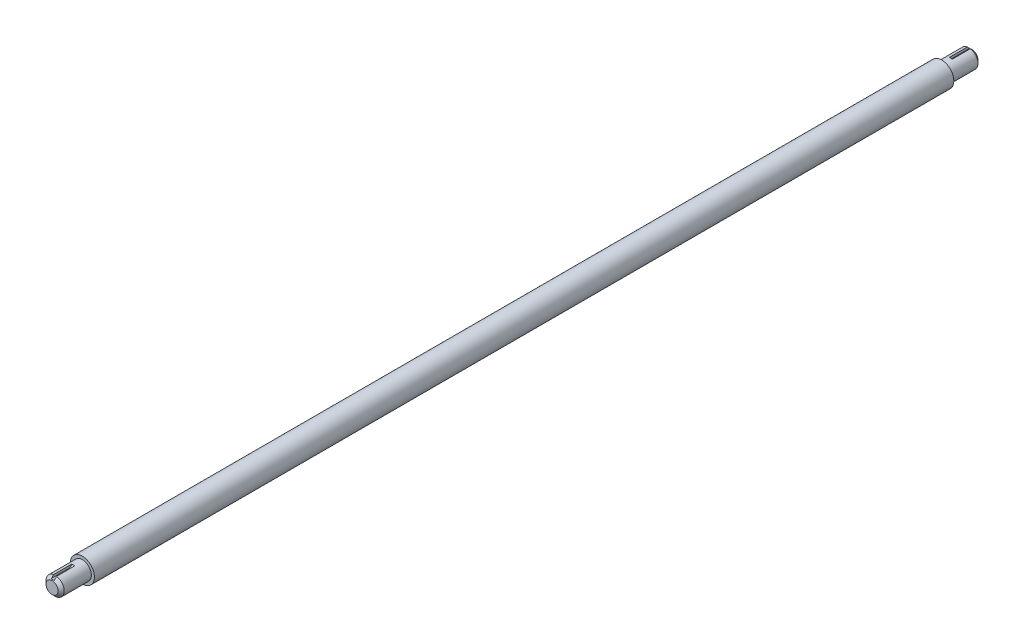
ISO-10303-21;
HEADER;
FILE_DESCRIPTION(('STEP AP214'),'2;1');
FILE_NAME('part.step','',(''),(''),'','','');
FILE_SCHEMA(('AUTOMOTIVE_DESIGN { 1 0 10303 214 1 1 1 1 }'));
ENDSEC;
DATA;
#1=APPLICATION_CONTEXT('core data for automotive mechanical design processes');
#2=APPLICATION_PROTOCOL_DEFINITION('international standard','automotive_design',2000,#1);
#3=PRODUCT_CONTEXT('',#1,'mechanical');
#4=PRODUCT('Part','Part','',(#3));
#5=PRODUCT_RELATED_PRODUCT_CATEGORY('part','',(#4));
#6=PRODUCT_DEFINITION_FORMATION('','',#4);
#7=PRODUCT_DEFINITION_CONTEXT('part definition',#1,'design');
#8=PRODUCT_DEFINITION('design','',#6,#7);
#9=PRODUCT_DEFINITION_SHAPE('','',#8);
#10=(LENGTH_UNIT() NAMED_UNIT(*) SI_UNIT(.MILLI.,.METRE.));
#11=(NAMED_UNIT(*) PLANE_ANGLE_UNIT() SI_UNIT($,.RADIAN.));
#12=(NAMED_UNIT(*) SI_UNIT($,.STERADIAN.) SOLID_ANGLE_UNIT());
#13=UNCERTAINTY_MEASURE_WITH_UNIT(LENGTH_MEASURE(1.E-05),#10,'distance_accuracy_value','');
#14=(GEOMETRIC_REPRESENTATION_CONTEXT(3) GLOBAL_UNCERTAINTY_ASSIGNED_CONTEXT((#13)) GLOBAL_UNIT_ASSIGNED_CONTEXT((#10,
#11,#12)) REPRESENTATION_CONTEXT('',''));
#15=CARTESIAN_POINT('',(0.,0.,0.));
#16=DIRECTION('',(0.,0.,1.));
#17=DIRECTION('',(1.,0.,0.));
#18=AXIS2_PLACEMENT_3D('',#15,#16,#17);
#19=CARTESIAN_POINT('',(-20.24,20.24,-100.));
#20=DIRECTION('',(0.,0.,-1.));
#21=DIRECTION('',(1.,0.,0.));
#22=AXIS2_PLACEMENT_3D('',#19,#20,#21);
#23=PLANE('',#22);
#24=CARTESIAN_POINT('',(0.,0.,-100.));
#25=DIRECTION('',(0.,0.,1.));
#26=DIRECTION('',(1.,0.,0.));
#27=AXIS2_PLACEMENT_3D('',#24,#25,#26);
#28=CIRCLE('',#27,20.);
#29=CARTESIAN_POINT('',(20.,0.,-100.));
#30=VERTEX_POINT('',#29);
#31=EDGE_CURVE('E270',#30,#30,#28,.F.);
#32=ORIENTED_EDGE('',*,*,#31,.T.);
#33=EDGE_LOOP('',(#32));
#34=FACE_BOUND('',#33,.T.);
#35=ADVANCED_FACE('F17',(#34),#23,.T.);
#36=CARTESIAN_POINT('',(-5.,22.,-98.454745261));
#37=DIRECTION('',(0.,1.,0.));
#38=DIRECTION('',(0.,0.,1.));
#39=AXIS2_PLACEMENT_3D('',#36,#37,#38);
#40=PLANE('',#39);
#41=DIRECTION('',(0.,0.,-1.));
#42=VECTOR('',#41,1.);
#43=CARTESIAN_POINT('',(-5.,22.,-63.7194858275));
#44=LINE('',#43,#42);
#45=CARTESIAN_POINT('',(-4.99999982624454,22.0000000000036,-39.7106214535359));
#46=VERTEX_POINT('',#45);
#47=CARTESIAN_POINT('',(-5.00000000144807,22.0000000020197,-97.4389716523527));
#48=VERTEX_POINT('',#47);
#49=EDGE_CURVE('E184',#46,#48,#44,.T.);
#50=ORIENTED_EDGE('',*,*,#49,.F.);
#51=CARTESIAN_POINT('',(5.47389001148944,22.0000000000089,-39.691464493183));
#52=CARTESIAN_POINT('',(4.56164562697729,22.0000000000091,-39.7305832894802));
#53=CARTESIAN_POINT('',(3.64913634182521,22.0000000000092,-39.7565364177244));
#54=CARTESIAN_POINT('',(1.82376031051066,22.0000000000094,-39.790221544182));
#55=CARTESIAN_POINT('',(0.910890728185676,22.0000000000094,-39.7979576280126));
#56=CARTESIAN_POINT('',(-0.915151707805007,22.0000000000094,-39.7979328121126));
#57=CARTESIAN_POINT('',(-1.82770090814348,22.0000000000094,-39.7901709243834));
#58=CARTESIAN_POINT('',(-3.65169196254198,22.0000000000092,-39.756467077981));
#59=CARTESIAN_POINT('',(-4.56313192680437,22.0000000000091,-39.7305184486922));
#60=CARTESIAN_POINT('',(-5.47377689550497,22.0000000000089,-39.691469344167));
#61=(BOUNDED_CURVE() B_SPLINE_CURVE(3,(#51,#52,#53,#54,#55,#56,#57,#58,#59,#60),.UNSPECIFIED.,
.F.,.F.) B_SPLINE_CURVE_WITH_KNOTS((4,2,2,2,4),(0.0164908681633382,0.0192244643562021,
0.0219580605490659,0.0246916567419297,0.0274252529347935),
.UNSPECIFIED.) CURVE() GEOMETRIC_REPRESENTATION_ITEM() RATIONAL_B_SPLINE_CURVE((0.999999540269166,
0.999999530613691,0.999999523105231,0.999999513004027,0.999999510420508,0.999999510428498,
0.999999513020038,0.999999523125189,0.999999530629584,0.999999540267969)) REPRESENTATION_ITEM(''));
#62=CARTESIAN_POINT('',(4.99999985131353,22.0000000000037,-39.7106215036471));
#63=VERTEX_POINT('',#62);
#64=EDGE_CURVE('E87',#46,#63,#61,.F.);
#65=ORIENTED_EDGE('',*,*,#64,.T.);
#66=DIRECTION('',(0.,0.,1.));
#67=VECTOR('',#66,1.);
#68=CARTESIAN_POINT('',(5.,22.,-63.7194858275));
#69=LINE('',#68,#67);
#70=CARTESIAN_POINT('',(5.,22.000000001508,-97.4389716531725));
#71=VERTEX_POINT('',#70);
#72=EDGE_CURVE('E176',#71,#63,#69,.T.);
#73=ORIENTED_EDGE('',*,*,#72,.F.);
#74=CARTESIAN_POINT('',(5.00000000517288,21.9999999993106,-97.4389716531939));
#75=CARTESIAN_POINT('',(4.79368425630204,21.9999999997459,-97.4846970703691));
#76=CARTESIAN_POINT('',(4.58680571553189,21.9999999999304,-97.5278526054406));
#77=CARTESIAN_POINT('',(4.17199827246078,22.0000000000696,-97.6088366908204));
#78=CARTESIAN_POINT('',(3.96406931657152,22.0000000000243,-97.6466649664496));
#79=CARTESIAN_POINT('',(3.33877011606581,21.9999999999514,-97.7518850793836));
#80=CARTESIAN_POINT('',(2.91996834440376,21.9999999999871,-97.8109941600565));
#81=CARTESIAN_POINT('',(2.08492254675457,22.0000000000128,-97.9052739906089));
#82=CARTESIAN_POINT('',(1.66871080220822,22.0000000000034,-97.9407313429312));
#83=CARTESIAN_POINT('',(0.834999231925228,21.9999999999966,-97.9880925447606));
#84=CARTESIAN_POINT('',(0.417499613187339,21.9999999999991,-98.0000000001048));
#85=CARTESIAN_POINT('',(-0.417499623173214,22.0000000000009,-97.9999999998952));
#86=CARTESIAN_POINT('',(-0.834999240795878,22.0000000000002,-97.9880925444045));
#87=CARTESIAN_POINT('',(-1.66871080884589,21.9999999999998,-97.9407313424063));
#88=CARTESIAN_POINT('',(-2.08492255227447,21.9999999999999,-97.9052739900618));
#89=CARTESIAN_POINT('',(-2.91996834767336,22.0000000000001,-97.8109941596103));
#90=CARTESIAN_POINT('',(-3.33877011820313,22.,-97.7518850790634));
#91=CARTESIAN_POINT('',(-3.96406931701422,22.,-97.6466649663554));
#92=CARTESIAN_POINT('',(-4.17199827233912,22.,-97.6088366908077));
#93=CARTESIAN_POINT('',(-4.58680571430622,22.,-97.5278526057163));
#94=CARTESIAN_POINT('',(-4.79368425453672,22.,-97.4846970708515));
#95=CARTESIAN_POINT('',(-5.00000000289306,22.,-97.4389716540019));
#96=B_SPLINE_CURVE_WITH_KNOTS('',3,(#74,#75,#76,#77,#78,#79,#80,#81,#82,#83,#84,#85,#86,#87,#88,
#89,#90,#91,#92,#93,#94,#95),.UNSPECIFIED.,.F.,.F.,(4,2,2,2,2,2,2,2,2,2,4),(0.,
0.633934033856558,1.26790074203564,2.53608223917394,3.78860285014225,5.04093166685659,
6.29326048024456,7.54578108788399,8.81396258160862,9.44792928808013,10.0818633202257),.UNSPECIFIED.);
#97=EDGE_CURVE('E265',#71,#48,#96,.T.);
#98=ORIENTED_EDGE('',*,*,#97,.T.);
#99=EDGE_LOOP('',(#50,#65,#73,#98));
#100=FACE_BOUND('',#99,.T.);
#101=ADVANCED_FACE('F249',(#100),#40,.T.);
#102=CARTESIAN_POINT('',(-5.,22.,-29.59536617));
#103=DIRECTION('',(1.,0.,0.));
#104=DIRECTION('',(0.,0.,-1.));
#105=AXIS2_PLACEMENT_3D('',#102,#103,#104);
#106=PLANE('',#105);
#107=DIRECTION('',(0.,0.,-1.));
#108=VECTOR('',#107,1.);
#109=CARTESIAN_POINT('',(-5.00000000563556,29.5803989145455,-45.));
#110=LINE('',#109,#108);
#111=CARTESIAN_POINT('',(-5.00000000281778,29.5803989118971,-90.0000000030809));
#112=VERTEX_POINT('',#111);
#113=CARTESIAN_POINT('',(-5.00000000281778,29.5803988639591,-29.9999999607556));
#114=VERTEX_POINT('',#113);
#115=EDGE_CURVE('E171',#112,#114,#110,.F.);
#116=ORIENTED_EDGE('',*,*,#115,.T.);
#117=CARTESIAN_POINT('',(-5.,29.5803988133728,-29.9999999515111));
#118=CARTESIAN_POINT('',(-5.,29.3075915698522,-30.0680590807903));
#119=CARTESIAN_POINT('',(-5.,29.0376770340366,-30.1476884773996));
#120=CARTESIAN_POINT('',(-5.,28.5055240211071,-30.3293867897986));
#121=CARTESIAN_POINT('',(-5.,28.2432851550353,-30.4314545663048));
#122=CARTESIAN_POINT('',(-5.,27.7284702758574,-30.6572811804903));
#123=CARTESIAN_POINT('',(-5.,27.4758896614901,-30.7810295285046));
#124=CARTESIAN_POINT('',(-5.,26.9820507614307,-31.049356618786));
#125=CARTESIAN_POINT('',(-5.,26.7407923456044,-31.1939351215594));
#126=CARTESIAN_POINT('',(-5.,26.2712128560046,-31.5029567355292));
#127=CARTESIAN_POINT('',(-5.,26.0428970165574,-31.6674078007018));
#128=CARTESIAN_POINT('',(-5.,25.6009266322717,-32.0149550958334));
#129=CARTESIAN_POINT('',(-5.,25.3872721177616,-32.1980513643598));
#130=CARTESIAN_POINT('',(-5.,24.9762090781648,-32.5815193507735));
#131=CARTESIAN_POINT('',(-5.,24.778795085431,-32.7818852076563));
#132=CARTESIAN_POINT('',(-5.,24.4015315606089,-33.1985183355668));
#133=CARTESIAN_POINT('',(-5.,24.2216818847167,-33.4147854763809));
#134=CARTESIAN_POINT('',(-5.,23.8807119419013,-33.861823675136));
#135=CARTESIAN_POINT('',(-5.,23.7196033204127,-34.0926036153808));
#136=CARTESIAN_POINT('',(-5.,23.4173819051931,-34.5669104903662));
#137=CARTESIAN_POINT('',(-5.,23.2762694551271,-34.810437644089));
#138=CARTESIAN_POINT('',(-5.,23.0150064973749,-35.3085718431165));
#139=CARTESIAN_POINT('',(-5.,22.8948617598486,-35.5631819143496));
#140=CARTESIAN_POINT('',(-5.,22.6764332538102,-36.0816099997116));
#141=CARTESIAN_POINT('',(-5.,22.5781488995276,-36.345427766892));
#142=CARTESIAN_POINT('',(-5.,22.4099516765001,-36.8625092742385));
#143=CARTESIAN_POINT('',(-5.,22.3385819345741,-37.1153004384456));
#144=CARTESIAN_POINT('',(-5.,22.2159193182245,-37.625699441082));
#145=CARTESIAN_POINT('',(-5.,22.1646254711497,-37.8833070455271));
#146=CARTESIAN_POINT('',(-5.,22.0824422477151,-38.4017109884174));
#147=CARTESIAN_POINT('',(-5.,22.0515494529324,-38.6625067851828));
#148=CARTESIAN_POINT('',(-5.,22.0103163081922,-39.1857408831299));
#149=CARTESIAN_POINT('',(-5.,21.9999777814542,-39.4481793279478));
#150=CARTESIAN_POINT('',(-5.,22.000000000009,-39.7106214535359));
#151=B_SPLINE_CURVE_WITH_KNOTS('',3,(#117,#118,#119,#120,#121,#122,#123,#124,#125,#126,#127,
#128,#129,#130,#131,#132,#133,#134,#135,#136,#137,#138,#139,#140,#141,#142,#143,#144,#145,#146,
#147,#148,#149,#150),.UNSPECIFIED.,.F.,.F.,(4,2,2,2,2,2,2,2,2,2,2,2,2,2,2,2,4),(0.,
0.843247838680898,1.68645287228135,2.52925106077263,3.37203956000975,4.21516650891947,
5.05829520186695,5.90113886959256,6.74397563615357,7.58733336349366,8.4307055834799,
9.27430952856135,10.117890865716,10.9051084411617,11.6922878722085,12.4793353691117,
13.2664526761506),.UNSPECIFIED.);
#152=EDGE_CURVE('E183',#114,#46,#151,.T.);
#153=ORIENTED_EDGE('',*,*,#152,.T.);
#154=ORIENTED_EDGE('',*,*,#49,.T.);
#155=CARTESIAN_POINT('',(-4.99999999973077,22.0000000038789,-97.4389716505395));
#156=CARTESIAN_POINT('',(-4.99999999990278,22.6336526474123,-96.821049738444));
#157=CARTESIAN_POINT('',(-4.99999999997383,23.2666765770236,-96.2024839727186));
#158=CARTESIAN_POINT('',(-5.00000000002617,24.5316866836814,-94.9642944420839));
#159=CARTESIAN_POINT('',(-5.00000000000748,25.1636728626604,-94.3446706791492));
#160=CARTESIAN_POINT('',(-4.99999999999252,26.4268290494353,-93.1045930030611));
#161=CARTESIAN_POINT('',(-4.99999999999626,27.0579990578188,-92.4841390905061));
#162=CARTESIAN_POINT('',(-5.00000000000374,28.3196673579101,-91.2425462955128));
#163=CARTESIAN_POINT('',(-5.00000000000748,28.9501656483704,-90.6214074118068));
#164=CARTESIAN_POINT('',(-5.,29.5803989092488,-90.0000000061619));
#165=B_SPLINE_CURVE_WITH_KNOTS('',3,(#155,#156,#157,#158,#159,#160,#161,#162,#163,#164),
.UNSPECIFIED.,.F.,.F.,(4,2,2,2,4),(0.,2.65519894453806,5.31039293864446,7.96558501968443,
10.6207820233168),.UNSPECIFIED.);
#166=EDGE_CURVE('E21',#48,#112,#165,.T.);
#167=ORIENTED_EDGE('',*,*,#166,.T.);
#168=EDGE_LOOP('',(#116,#153,#154,#167));
#169=FACE_BOUND('',#168,.T.);
#170=ADVANCED_FACE('F244',(#169),#106,.T.);
#171=CARTESIAN_POINT('',(5.,22.,-97.843605485));
#172=DIRECTION('',(-1.,0.,0.));
#173=DIRECTION('',(0.,0.,1.));
#174=AXIS2_PLACEMENT_3D('',#171,#172,#173);
#175=PLANE('',#174);
#176=ORIENTED_EDGE('',*,*,#72,.T.);
#177=CARTESIAN_POINT('',(5.,22.0000000000093,-39.7106215036471));
#178=CARTESIAN_POINT('',(5.,21.9999702694099,-39.4290246704989));
#179=CARTESIAN_POINT('',(5.,22.011876875962,-39.1474322448037));
#180=CARTESIAN_POINT('',(5.,22.0593443514043,-38.5862606185158));
#181=CARTESIAN_POINT('',(5.,22.0949041257463,-38.3066813253707));
#182=CARTESIAN_POINT('',(5.,22.1894391403596,-37.7516338502353));
#183=CARTESIAN_POINT('',(5.,22.2484042595103,-37.4761639445856));
#184=CARTESIAN_POINT('',(5.,22.3893218018532,-36.9311718093638));
#185=CARTESIAN_POINT('',(4.99999999999999,22.4712739378507,-36.6616495055289));
#186=CARTESIAN_POINT('',(4.99999999999999,22.6576273044546,-36.1303521225974));
#187=CARTESIAN_POINT('',(5.,22.7620380429585,-35.8685803782796));
#188=CARTESIAN_POINT('',(5.,22.992547225036,-35.3547661373164));
#189=CARTESIAN_POINT('',(5.,23.1186456917132,-35.1027236510357));
#190=CARTESIAN_POINT('',(5.,23.3915885544857,-34.6102487736051));
#191=CARTESIAN_POINT('',(5.,23.5384257076824,-34.3698123682504));
#192=CARTESIAN_POINT('',(5.,23.8518366459279,-33.9021697854187));
#193=CARTESIAN_POINT('',(5.,24.0184102515681,-33.6749634877051));
#194=CARTESIAN_POINT('',(5.,24.3700757212774,-33.2354451206267));
#195=CARTESIAN_POINT('',(5.,24.5551635994552,-33.0231298620796));
#196=CARTESIAN_POINT('',(5.,24.9425781652124,-32.614849704525));
#197=CARTESIAN_POINT('',(5.,25.14490515131,-32.4188850887669));
#198=CARTESIAN_POINT('',(5.,25.5654112075571,-32.0446613698017));
#199=CARTESIAN_POINT('',(5.,25.783594344602,-31.8664068369478));
#200=CARTESIAN_POINT('',(5.,26.2342151484153,-31.5289362003325));
#201=CARTESIAN_POINT('',(5.,26.4666523918164,-31.3697195315334));
#202=CARTESIAN_POINT('',(5.,26.9270674245423,-31.0821157904545));
#203=CARTESIAN_POINT('',(5.,27.1541789379987,-30.9523392426413));
#204=CARTESIAN_POINT('',(5.,27.6178635792027,-30.7109827093422));
#205=CARTESIAN_POINT('',(5.,27.854436202922,-30.5994017561133));
#206=CARTESIAN_POINT('',(5.,28.3355611102571,-30.3951437643027));
#207=CARTESIAN_POINT('',(5.,28.580112141987,-30.3024637763761));
#208=CARTESIAN_POINT('',(5.,29.0757421800611,-30.1365247019609));
#209=CARTESIAN_POINT('',(5.,29.3268218071006,-30.0632674695262));
#210=CARTESIAN_POINT('',(5.,29.5803988041545,-29.9999999546732));
#211=B_SPLINE_CURVE_WITH_KNOTS('',3,(#177,#178,#179,#180,#181,#182,#183,#184,#185,#186,#187,
#188,#189,#190,#191,#192,#193,#194,#195,#196,#197,#198,#199,#200,#201,#202,#203,#204,#205,#206,
#207,#208,#209,#210),.UNSPECIFIED.,.F.,.F.,(4,2,2,2,2,2,2,2,2,2,2,2,2,2,2,2,4),(0.,
0.844532700493406,1.68902632302662,2.53315516022258,3.37727345152956,4.22174980794939,
5.06622706397881,5.91041011586198,6.75458549452655,7.59857952234938,8.44258816802452,
9.28681406013349,10.131014889664,10.9149478569191,11.6988391166545,12.4826079626618,
13.2664515986191),.UNSPECIFIED.);
#212=CARTESIAN_POINT('',(4.99999996501327,29.5803988657401,-29.9999999407779));
#213=VERTEX_POINT('',#212);
#214=EDGE_CURVE('E239',#63,#213,#211,.T.);
#215=ORIENTED_EDGE('',*,*,#214,.T.);
#216=DIRECTION('',(0.,0.,1.));
#217=VECTOR('',#216,1.);
#218=CARTESIAN_POINT('',(5.00000001094782,29.5803989136476,-45.));
#219=LINE('',#218,#217);
#220=CARTESIAN_POINT('',(5.00000000547391,29.580398912719,-90.0000000018279));
#221=VERTEX_POINT('',#220);
#222=EDGE_CURVE('E164',#213,#221,#219,.F.);
#223=ORIENTED_EDGE('',*,*,#222,.T.);
#224=CARTESIAN_POINT('',(5.,29.5803989117905,-90.0000000036558));
#225=CARTESIAN_POINT('',(5.,28.9501656506114,-90.6214074095896));
#226=CARTESIAN_POINT('',(5.,28.319667359857,-91.2425462935913));
#227=CARTESIAN_POINT('',(5.,27.0579990591769,-92.4841390891754));
#228=CARTESIAN_POINT('',(5.,26.4268290504986,-93.1045930020256));
#229=CARTESIAN_POINT('',(5.,25.1636728631203,-94.3446706786895));
#230=CARTESIAN_POINT('',(5.,24.5316866838326,-94.9642944419048));
#231=CARTESIAN_POINT('',(5.,23.26667657661,-96.2024839731547));
#232=CARTESIAN_POINT('',(5.,22.6336526467425,-96.8210497392145));
#233=CARTESIAN_POINT('',(5.,22.0000000030125,-97.4389716517054));
#234=B_SPLINE_CURVE_WITH_KNOTS('',3,(#224,#225,#226,#227,#228,#229,#230,#231,#232,#233),
.UNSPECIFIED.,.F.,.F.,(4,2,2,2,4),(0.,2.6551970048834,5.31038908717456,7.9655830825319,
10.6207820283207),.UNSPECIFIED.);
#235=EDGE_CURVE('E178',#221,#71,#234,.T.);
#236=ORIENTED_EDGE('',*,*,#235,.T.);
#237=EDGE_LOOP('',(#176,#215,#223,#236));
#238=FACE_BOUND('',#237,.T.);
#239=ADVANCED_FACE('F248',(#238),#175,.T.);
#240=CARTESIAN_POINT('',(0.,0.,-100.));
#241=DIRECTION('',(0.,0.,1.));
#242=DIRECTION('',(1.,0.,0.));
#243=AXIS2_PLACEMENT_3D('',#240,#241,#242);
#244=CONICAL_SURFACE('',#243,20.,0.785398163397448);
#245=CARTESIAN_POINT('',(0.,0.,-90.));
#246=DIRECTION('',(0.,0.,1.));
#247=DIRECTION('',(0.,-1.,0.));
#248=AXIS2_PLACEMENT_3D('',#245,#246,#247);
#249=CIRCLE('',#248,30.);
#250=EDGE_CURVE('E81',#221,#112,#249,.F.);
#251=ORIENTED_EDGE('',*,*,#250,.T.);
#252=ORIENTED_EDGE('',*,*,#166,.F.);
#253=ORIENTED_EDGE('',*,*,#97,.F.);
#254=ORIENTED_EDGE('',*,*,#235,.F.);
#255=EDGE_LOOP('',(#251,#252,#253,#254));
#256=FACE_BOUND('',#255,.T.);
#257=ORIENTED_EDGE('',*,*,#31,.F.);
#258=EDGE_LOOP('',(#257));
#259=FACE_BOUND('',#258,.T.);
#260=ADVANCED_FACE('F208',(#256,#259),#244,.T.);
#261=CARTESIAN_POINT('',(5.058300033,29.570485298,-30.));
#262=CARTESIAN_POINT('',(5.139532758,22.,-31.894328819));
#263=CARTESIAN_POINT('',(5.473890584,22.,-39.691477844));
#264=CARTESIAN_POINT('',(4.239311205,29.710580775,-30.));
#265=CARTESIAN_POINT('',(4.293809195,22.,-31.813638981));
#266=CARTESIAN_POINT('',(4.561646083,22.,-39.730596769));
#267=CARTESIAN_POINT('',(3.402436291,29.81853391,-30.));
#268=CARTESIAN_POINT('',(3.443736571,22.,-31.747444553));
#269=CARTESIAN_POINT('',(3.64913669,22.,-39.756549994));
#270=CARTESIAN_POINT('',(1.709747052,29.963282568,-30.));
#271=CARTESIAN_POINT('',(1.726140912,22.,-31.656830968));
#272=CARTESIAN_POINT('',(1.823760475,22.,-39.790235249));
#273=CARTESIAN_POINT('',(0.853960126,30.000056921,-30.));
#274=CARTESIAN_POINT('',(0.863450629,22.,-31.632956497));
#275=CARTESIAN_POINT('',(0.910890808,22.,-39.797971365));
#276=CARTESIAN_POINT('',(-0.857954795,29.999942946,-30.));
#277=CARTESIAN_POINT('',(-0.867485573,22.,-31.633029912));
#278=CARTESIAN_POINT('',(-0.915151788,22.,-39.797946549));
#279=CARTESIAN_POINT('',(-1.713423042,29.963053906,-30.));
#280=CARTESIAN_POINT('',(-1.72986453,22.,-31.656977107));
#281=CARTESIAN_POINT('',(-1.827701073,22.,-39.790184629));
#282=CARTESIAN_POINT('',(-3.404784229,29.818247136,-30.));
#283=CARTESIAN_POINT('',(-3.446127523,22.,-31.747620873));
#284=CARTESIAN_POINT('',(-3.651692311,22.,-39.756480654));
#285=CARTESIAN_POINT('',(-4.240646003,29.710349555,-30.));
#286=CARTESIAN_POINT('',(-4.295196438,22.,-31.813772538));
#287=CARTESIAN_POINT('',(-4.563132383,22.,-39.730531928));
#288=CARTESIAN_POINT('',(-5.058198476,29.57050267,-30.));
#289=CARTESIAN_POINT('',(-5.139428475,22.,-31.894318869));
#290=CARTESIAN_POINT('',(-5.473777468,22.,-39.691482695));
#291=(BOUNDED_SURFACE() B_SPLINE_SURFACE(3,2,((#261,#262,#263),(#264,#265,#266),(#267,#268,
#269),(#270,#271,#272),(#273,#274,#275),(#276,#277,#278),(#279,#280,#281),(#282,#283,#284),
(#285,#286,#287),(#288,#289,#290)),.UNSPECIFIED.,.F.,.F.,.F.) B_SPLINE_SURFACE_WITH_KNOTS((4,2,
2,2,4),(3,3),(0.0164908681633382,0.0192244643562021,0.0219580605490659,0.0246916567419297,
0.0274252529347935),(0.,1.),
.UNSPECIFIED.) GEOMETRIC_REPRESENTATION_ITEM() RATIONAL_B_SPLINE_SURFACE(((1.,0.788337323158158,
1.),(1.,0.78389188793214,1.),(1.,0.780434950289406,1.),(1.,0.775784299093997,1.),(1.,
0.774594832114863,1.),(1.,0.774598510659955,1.),(1.,0.775791670523801,1.),(1.,0.780444139292732,
1.),(1.,0.7838992049373,1.),(1.,0.788336772252647,1.))) REPRESENTATION_ITEM('') SURFACE());
#292=CARTESIAN_POINT('',(-4.99999986287883,29.5803989386758,-29.9999999260212));
#293=CARTESIAN_POINT('',(-4.58576232278662,29.6504184744744,-29.9999916481539));
#294=CARTESIAN_POINT('',(-4.17009865387382,29.7117268597878,-29.9999906136708));
#295=CARTESIAN_POINT('',(-3.33656573732168,29.816837625825,-29.9999937199489));
#296=CARTESIAN_POINT('',(-2.91869649990553,29.8606400876198,-29.9999978606861));
#297=CARTESIAN_POINT('',(-1.66875109952642,29.9651616224614,-30.0000040488849));
#298=CARTESIAN_POINT('',(-0.834375494869063,30.0000000030486,-30.0000000103293));
#299=CARTESIAN_POINT('',(0.834375689148535,29.9999999969514,-29.9999999895193));
#300=CARTESIAN_POINT('',(1.66875126850878,29.9651616123556,-30.0000040072646));
#301=CARTESIAN_POINT('',(2.91869663080722,29.8606400746458,-29.9999978918557));
#302=CARTESIAN_POINT('',(3.3365658554143,29.8168376124312,-29.9999937930545));
#303=CARTESIAN_POINT('',(4.1700987464247,29.711726846619,-29.9999907150406));
#304=CARTESIAN_POINT('',(4.58576240260481,29.6504184619503,-29.9999917358518));
#305=CARTESIAN_POINT('',(4.99999993002654,29.5803989273258,-29.9999999268826));
#306=B_SPLINE_CURVE_WITH_KNOTS('',3,(#292,#293,#294,#295,#296,#297,#298,#299,#300,#301,#302,
#303,#304,#305),.UNSPECIFIED.,.F.,.F.,(4,2,2,2,2,2,4),(0.,1.26015705099986,2.52030826607842,
5.02253114327451,7.52475394546816,8.78490512248638,10.045062135441),.UNSPECIFIED.);
#307=EDGE_CURVE('E173',#114,#213,#306,.T.);
#308=ORIENTED_EDGE('',*,*,#152,.F.);
#309=ORIENTED_EDGE('',*,*,#307,.T.);
#310=ORIENTED_EDGE('',*,*,#214,.F.);
#311=ORIENTED_EDGE('',*,*,#64,.F.);
#312=EDGE_LOOP('',(#308,#309,#310,#311));
#313=FACE_BOUND('',#312,.T.);
#314=ADVANCED_FACE('F197',(#313),#291,.F.);
#315=CARTESIAN_POINT('',(0.,0.,-90.));
#316=DIRECTION('',(0.,0.,1.));
#317=DIRECTION('',(1.,0.,0.));
#318=AXIS2_PLACEMENT_3D('',#315,#316,#317);
#319=CYLINDRICAL_SURFACE('',#318,30.);
#320=CARTESIAN_POINT('',(0.,0.,0.));
#321=DIRECTION('',(0.,0.,1.));
#322=DIRECTION('',(1.,0.,0.));
#323=AXIS2_PLACEMENT_3D('',#320,#321,#322);
#324=CIRCLE('',#323,30.);
#325=CARTESIAN_POINT('',(30.,0.,0.));
#326=VERTEX_POINT('',#325);
#327=EDGE_CURVE('E236',#326,#326,#324,.F.);
#328=ORIENTED_EDGE('',*,*,#327,.T.);
#329=EDGE_LOOP('',(#328));
#330=FACE_BOUND('',#329,.T.);
#331=ORIENTED_EDGE('',*,*,#307,.F.);
#332=ORIENTED_EDGE('',*,*,#115,.F.);
#333=ORIENTED_EDGE('',*,*,#250,.F.);
#334=ORIENTED_EDGE('',*,*,#222,.F.);
#335=EDGE_LOOP('',(#331,#332,#333,#334));
#336=FACE_BOUND('',#335,.T.);
#337=ADVANCED_FACE('F207',(#330,#336),#319,.T.);
#338=CARTESIAN_POINT('',(-40.48,-40.48,0.));
#339=DIRECTION('',(0.,0.,1.));
#340=DIRECTION('',(1.,0.,0.));
#341=AXIS2_PLACEMENT_3D('',#338,#339,#340);
#342=PLANE('',#341);
#343=ORIENTED_EDGE('',*,*,#327,.F.);
#344=EDGE_LOOP('',(#343));
#345=FACE_BOUND('',#344,.T.);
#346=CARTESIAN_POINT('',(0.,0.,0.));
#347=DIRECTION('',(0.,0.,-1.));
#348=DIRECTION('',(-1.,0.,0.));
#349=AXIS2_PLACEMENT_3D('',#346,#347,#348);
#350=CIRCLE('',#349,40.);
#351=CARTESIAN_POINT('',(-40.,0.,0.));
#352=VERTEX_POINT('',#351);
#353=EDGE_CURVE('E331',#352,#352,#350,.T.);
#354=ORIENTED_EDGE('',*,*,#353,.T.);
#355=EDGE_LOOP('',(#354));
#356=FACE_BOUND('',#355,.T.);
#357=ADVANCED_FACE('F257',(#345,#356),#342,.F.);
#358=CARTESIAN_POINT('',(0.,0.,2840.));
#359=DIRECTION('',(0.,0.,-1.));
#360=DIRECTION('',(-1.,0.,0.));
#361=AXIS2_PLACEMENT_3D('',#358,#359,#360);
#362=CYLINDRICAL_SURFACE('',#361,40.);
#363=ORIENTED_EDGE('',*,*,#353,.F.);
#364=EDGE_LOOP('',(#363));
#365=FACE_BOUND('',#364,.T.);
#366=CARTESIAN_POINT('',(0.,0.,2840.));
#367=DIRECTION('',(0.,0.,-1.));
#368=DIRECTION('',(-1.,0.,0.));
#369=AXIS2_PLACEMENT_3D('',#366,#367,#368);
#370=CIRCLE('',#369,40.);
#371=CARTESIAN_POINT('',(-40.,0.,2840.));
#372=VERTEX_POINT('',#371);
#373=EDGE_CURVE('E329',#372,#372,#370,.F.);
#374=ORIENTED_EDGE('',*,*,#373,.F.);
#375=EDGE_LOOP('',(#374));
#376=FACE_BOUND('',#375,.T.);
#377=ADVANCED_FACE('F148',(#365,#376),#362,.T.);
#378=CARTESIAN_POINT('',(-5.058300033,29.570485298,2870.));
#379=CARTESIAN_POINT('',(-5.139532758,22.,2871.894328819));
#380=CARTESIAN_POINT('',(-5.473890584,22.,2879.691477844));
#381=CARTESIAN_POINT('',(-4.239311205,29.710580775,2870.));
#382=CARTESIAN_POINT('',(-4.293809195,22.,2871.813638982));
#383=CARTESIAN_POINT('',(-4.561646083,22.,2879.730596769));
#384=CARTESIAN_POINT('',(-3.402436291,29.81853391,2870.));
#385=CARTESIAN_POINT('',(-3.443736571,22.,2871.747444553));
#386=CARTESIAN_POINT('',(-3.64913669,22.,2879.756549994));
#387=CARTESIAN_POINT('',(-1.709747052,29.963282568,2870.));
#388=CARTESIAN_POINT('',(-1.726140912,22.,2871.656830968));
#389=CARTESIAN_POINT('',(-1.823760475,22.,2879.790235248));
#390=CARTESIAN_POINT('',(-0.853960126,30.000056921,2870.));
#391=CARTESIAN_POINT('',(-0.863450629,22.,2871.632956497));
#392=CARTESIAN_POINT('',(-0.910890808,22.,2879.797971365));
#393=CARTESIAN_POINT('',(0.857954795,29.999942946,2870.));
#394=CARTESIAN_POINT('',(0.867485573,22.,2871.633029912));
#395=CARTESIAN_POINT('',(0.915151788,22.,2879.797946548));
#396=CARTESIAN_POINT('',(1.713423042,29.963053906,2870.));
#397=CARTESIAN_POINT('',(1.72986453,22.,2871.656977107));
#398=CARTESIAN_POINT('',(1.827701073,22.,2879.790184629));
#399=CARTESIAN_POINT('',(3.404784229,29.818247136,2870.));
#400=CARTESIAN_POINT('',(3.446127523,22.,2871.747620873));
#401=CARTESIAN_POINT('',(3.651692311,22.,2879.756480654));
#402=CARTESIAN_POINT('',(4.240646003,29.710349555,2870.));
#403=CARTESIAN_POINT('',(4.295196438,22.,2871.813772538));
#404=CARTESIAN_POINT('',(4.563132383,22.,2879.730531927));
#405=CARTESIAN_POINT('',(5.058198476,29.57050267,2870.));
#406=CARTESIAN_POINT('',(5.139428475,22.,2871.894318869));
#407=CARTESIAN_POINT('',(5.473777468,22.,2879.691482695));
#408=(BOUNDED_SURFACE() B_SPLINE_SURFACE(3,2,((#378,#379,#380),(#381,#382,#383),(#384,#385,
#386),(#387,#388,#389),(#390,#391,#392),(#393,#394,#395),(#396,#397,#398),(#399,#400,#401),
(#402,#403,#404),(#405,#406,#407)),.UNSPECIFIED.,.F.,.F.,.F.) B_SPLINE_SURFACE_WITH_KNOTS((4,2,
2,2,4),(3,3),(0.016490868163338,0.0192244643562018,0.0219580605490657,0.0246916567419295,
0.0274252529347933),(0.,1.),
.UNSPECIFIED.) GEOMETRIC_REPRESENTATION_ITEM() RATIONAL_B_SPLINE_SURFACE(((1.,0.788337323158169,
1.),(1.,0.783891887933118,1.),(1.,0.78043495028809,1.),(1.,0.775784299095316,1.),(1.,
0.774594832113802,1.),(1.,0.774598510661022,1.),(1.,0.775791670524547,1.),(1.,0.780444139291959,
1.),(1.,0.783899204937874,1.),(1.,0.788336772252646,1.))) REPRESENTATION_ITEM('') SURFACE());
#409=CARTESIAN_POINT('',(-5.47389001148946,22.0000000000089,2879.69146449318));
#410=CARTESIAN_POINT('',(-4.5616456269773,22.0000000000091,2879.73058328948));
#411=CARTESIAN_POINT('',(-3.64913634182522,22.0000000000092,2879.75653641772));
#412=CARTESIAN_POINT('',(-1.82376031051066,22.0000000000094,2879.79022154318));
#413=CARTESIAN_POINT('',(-0.910890728185679,22.0000000000094,2879.79795762801));
#414=CARTESIAN_POINT('',(0.91515170780501,22.0000000000094,2879.79793281111));
#415=CARTESIAN_POINT('',(1.82770090814349,22.0000000000094,2879.79017092438));
#416=CARTESIAN_POINT('',(3.65169196254199,22.0000000000092,2879.75646707798));
#417=CARTESIAN_POINT('',(4.56313192680439,22.0000000000091,2879.73051844769));
#418=CARTESIAN_POINT('',(5.47377689550498,22.0000000000089,2879.69146934417));
#419=(BOUNDED_CURVE() B_SPLINE_CURVE(3,(#409,#410,#411,#412,#413,#414,#415,#416,#417,#418),
.UNSPECIFIED.,.F.,.F.) B_SPLINE_CURVE_WITH_KNOTS((4,2,2,2,4),(0.016490868163338,
0.0192244643562018,0.0219580605490657,0.0246916567419295,0.0274252529347933),
.UNSPECIFIED.) CURVE() GEOMETRIC_REPRESENTATION_ITEM() RATIONAL_B_SPLINE_CURVE((0.999999540269181,
0.999999530613707,0.999999523105247,0.999999513004044,0.999999510420524,0.999999510428514,
0.999999513020054,0.999999523125205,0.999999530629599,0.999999540267985)) REPRESENTATION_ITEM(''));
#420=CARTESIAN_POINT('',(-4.99999985131345,22.0000000000037,2879.71062150721));
#421=VERTEX_POINT('',#420);
#422=CARTESIAN_POINT('',(4.99999982624462,22.0000000000036,2879.71062145339));
#423=VERTEX_POINT('',#422);
#424=EDGE_CURVE('E96',#421,#423,#419,.T.);
#425=CARTESIAN_POINT('',(5.,22.000000000009,2879.71062145339));
#426=CARTESIAN_POINT('',(5.,21.9999702637326,2879.42902463511));
#427=CARTESIAN_POINT('',(5.,22.0118768643859,2879.14743222405));
#428=CARTESIAN_POINT('',(5.,22.0593443274022,2878.58626062664));
#429=CARTESIAN_POINT('',(5.,22.0949040952113,2878.30668134772));
#430=CARTESIAN_POINT('',(5.,22.189439095854,2877.75163390107));
#431=CARTESIAN_POINT('',(5.,22.2484042075208,2877.47616400968));
#432=CARTESIAN_POINT('',(5.,22.3893217337619,2876.93117190228));
#433=CARTESIAN_POINT('',(5.,22.4712738611428,2876.66164961202));
#434=CARTESIAN_POINT('',(5.,22.6576272090345,2876.1303522557));
#435=CARTESIAN_POINT('',(5.,22.7620379374149,2875.86858052441));
#436=CARTESIAN_POINT('',(5.,22.9925470976426,2875.35476630834));
#437=CARTESIAN_POINT('',(5.,23.1186455525942,2875.10272383392));
#438=CARTESIAN_POINT('',(5.,23.3915883902884,2874.61024897854));
#439=CARTESIAN_POINT('',(5.,23.5384255301471,2874.36981258339));
#440=CARTESIAN_POINT('',(5.,23.8518364399928,2873.90217001914));
#441=CARTESIAN_POINT('',(5.,24.018410030572,2873.6749637298));
#442=CARTESIAN_POINT('',(5.,24.370075474558,2873.23544536974));
#443=CARTESIAN_POINT('',(5.,24.5551633427115,2873.02313011035));
#444=CARTESIAN_POINT('',(5.,24.9425778880701,2872.6148499498));
#445=CARTESIAN_POINT('',(5.,25.1449048637934,2872.4188853319));
#446=CARTESIAN_POINT('',(5.,25.5654108990555,2872.04466160719));
#447=CARTESIAN_POINT('',(5.,25.7835940254904,2871.86640707075));
#448=CARTESIAN_POINT('',(5.,26.2342148079948,2871.52893642543));
#449=CARTESIAN_POINT('',(5.00000000000001,26.4666520406978,2871.36971975152));
#450=CARTESIAN_POINT('',(5.00000000000001,26.9270670879421,2871.08211597721));
#451=CARTESIAN_POINT('',(5.,27.1541786283196,2870.95233940412));
#452=CARTESIAN_POINT('',(5.,27.6178633263958,2870.71098282482));
#453=CARTESIAN_POINT('',(5.,27.854435980067,2870.59940185086));
#454=CARTESIAN_POINT('',(5.,28.3355609500442,2870.39514382237));
#455=CARTESIAN_POINT('',(5.,28.5801120144729,2870.30246381851));
#456=CARTESIAN_POINT('',(5.,29.0757421198336,2870.13652471743));
#457=CARTESIAN_POINT('',(5.,29.3268217814605,2870.06326747426));
#458=CARTESIAN_POINT('',(5.,29.5803988137587,2869.99999995141));
#459=B_SPLINE_CURVE_WITH_KNOTS('',3,(#425,#426,#427,#428,#429,#430,#431,#432,#433,#434,#435,
#436,#437,#438,#439,#440,#441,#442,#443,#444,#445,#446,#447,#448,#449,#450,#451,#452,#453,#454,
#455,#456,#457,#458),.UNSPECIFIED.,.F.,.F.,(4,2,2,2,2,2,2,2,2,2,2,2,2,2,2,2,4),(0.,
0.844532655874358,1.6890262335957,2.53315502432471,3.37727326921358,4.2217495781686,
5.06622678676547,5.9104097918058,6.75458512365831,7.5985791336925,8.4425877615771,
9.28681363593118,10.1310144477588,10.9149475224148,11.6988388896386,12.4826078439934,
13.266451588255),.UNSPECIFIED.);
#460=CARTESIAN_POINT('',(4.99999999978427,29.5803988646649,2869.99999996071));
#461=VERTEX_POINT('',#460);
#462=EDGE_CURVE('E101',#423,#461,#459,.T.);
#463=CARTESIAN_POINT('',(4.99999986045209,29.580398939086,2869.99999992602));
#464=CARTESIAN_POINT('',(4.59290851123312,29.6492152102086,2869.9999887362));
#465=CARTESIAN_POINT('',(4.1843953742536,29.7096175973777,2869.99998912948));
#466=CARTESIAN_POINT('',(3.36518195958807,29.8135197700763,2869.99999513526));
#467=CARTESIAN_POINT('',(2.95448145880755,29.857017796677,2870.00000074831));
#468=CARTESIAN_POINT('',(2.13198684805798,29.926992107733,2869.99999924214));
#469=CARTESIAN_POINT('',(1.72019397486059,29.9534829281649,2869.99999213382));
#470=CARTESIAN_POINT('',(0.895911598914592,29.9894565362111,2869.99999239777));
#471=CARTESIAN_POINT('',(0.483422176836819,29.9989411740499,2869.99999976846));
#472=CARTESIAN_POINT('',(-0.352105646337934,30.000916044323,2870.00000006912));
#473=CARTESIAN_POINT('',(-0.775145152801886,29.9929672987203,2869.99999262653));
#474=CARTESIAN_POINT('',(-1.62046387990616,29.9591891042213,2869.99999212046));
#475=CARTESIAN_POINT('',(-2.04274317639698,29.9333615511279,2869.99999905546));
#476=CARTESIAN_POINT('',(-2.88888505744865,29.8636204125396,2870.00000063887));
#477=CARTESIAN_POINT('',(-3.31273696595273,29.8195772215918,2869.99999519794));
#478=CARTESIAN_POINT('',(-4.15823102918106,29.713477775115,2869.99998937907));
#479=CARTESIAN_POINT('',(-4.57987291689855,29.6514193918979,2869.99998900173));
#480=CARTESIAN_POINT('',(-4.99999992062112,29.5803989289156,2869.99999992688));
#481=B_SPLINE_CURVE_WITH_KNOTS('',3,(#463,#464,#465,#466,#467,#468,#469,#470,#471,#472,#473,
#474,#475,#476,#477,#478,#479,#480),.UNSPECIFIED.,.F.,.F.,(4,2,2,2,2,2,2,2,4),(0.,
1.23851191533898,2.47715266557589,3.71473334122097,4.95217936343013,6.22114155328701,
7.48996920766177,8.76798434884644,10.0461504917293),.UNSPECIFIED.);
#482=CARTESIAN_POINT('',(-4.99999996031056,29.5803988672833,2869.99999994059));
#483=VERTEX_POINT('',#482);
#484=EDGE_CURVE('E127',#461,#483,#481,.T.);
#485=CARTESIAN_POINT('',(-5.,29.5803988056512,2869.9999999543));
#486=CARTESIAN_POINT('',(-5.,29.3075915653349,2870.06805908358));
#487=CARTESIAN_POINT('',(-5.,29.0376770326998,2870.14768847997));
#488=CARTESIAN_POINT('',(-5.,28.5055240260534,2870.32938679157));
#489=CARTESIAN_POINT('',(-5.,28.2432851630846,2870.4314545675));
#490=CARTESIAN_POINT('',(-5.,27.7284702900346,2870.65728118021));
#491=CARTESIAN_POINT('',(-5.,27.475889678692,2870.78102952732));
#492=CARTESIAN_POINT('',(-5.,26.9820507845854,2871.04935661553));
#493=CARTESIAN_POINT('',(-5.,26.7407923716871,2871.19393511713));
#494=CARTESIAN_POINT('',(-5.,26.2712128878314,2871.50295672851));
#495=CARTESIAN_POINT('',(-5.,26.0428970512004,2871.66740779226));
#496=CARTESIAN_POINT('',(-5.,25.600926672414,2872.01495508433));
#497=CARTESIAN_POINT('',(-5.,25.387272160587,2872.1980513512));
#498=CARTESIAN_POINT('',(-5.,24.9762091262216,2872.581519334));
#499=CARTESIAN_POINT('',(-5.,24.7787951360321,2872.78188518892));
#500=CARTESIAN_POINT('',(-5.,24.4015316160063,2873.19851831259));
#501=CARTESIAN_POINT('',(-5.,24.2216819423663,2873.41478545113));
#502=CARTESIAN_POINT('',(-5.,23.8807120031406,2873.86182364558));
#503=CARTESIAN_POINT('',(-5.,23.7196033830406,2874.09260358384));
#504=CARTESIAN_POINT('',(-5.,23.4173819700324,2874.56691045449));
#505=CARTESIAN_POINT('',(-5.,23.2762695207892,2874.81043760588));
#506=CARTESIAN_POINT('',(-5.,23.0150065637462,2875.30857180002));
#507=CARTESIAN_POINT('',(-5.,22.8948618261201,2875.56318186871));
#508=CARTESIAN_POINT('',(-5.,22.6764333187274,2876.08160994867));
#509=CARTESIAN_POINT('',(-5.,22.5781489631914,2876.34542771298));
#510=CARTESIAN_POINT('',(-5.,22.4099517325342,2876.86250922611));
#511=CARTESIAN_POINT('',(-5.,22.3385819852375,2877.11530039928));
#512=CARTESIAN_POINT('',(-5.,22.2159193584451,2877.62569942017));
#513=CARTESIAN_POINT('',(-5.,22.1646255062996,2877.8833070339));
#514=CARTESIAN_POINT('',(-5.,22.0824422728868,2878.40171099525));
#515=CARTESIAN_POINT('',(-5.,22.0515494731653,2878.66250680118));
#516=CARTESIAN_POINT('',(-5.,22.0103163184373,2879.18574091774));
#517=CARTESIAN_POINT('',(-5.,21.9999777866456,2879.448179372));
#518=CARTESIAN_POINT('',(-5.,22.0000000000093,2879.71062150721));
#519=B_SPLINE_CURVE_WITH_KNOTS('',3,(#485,#486,#487,#488,#489,#490,#491,#492,#493,#494,#495,
#496,#497,#498,#499,#500,#501,#502,#503,#504,#505,#506,#507,#508,#509,#510,#511,#512,#513,#514,
#515,#516,#517,#518),.UNSPECIFIED.,.F.,.F.,(4,2,2,2,2,2,2,2,2,2,2,2,2,2,2,2,4),(0.,
0.843247829364638,1.68645285367828,2.52925103284665,3.37203952275095,4.21516646233298,
5.05829514595532,5.90113880414517,6.7439755611725,7.58733328126749,8.43070549400649,
9.27430943240296,10.1178907629222,10.9051083686093,11.6922878299598,12.4793353559548,
13.2664526919162),.UNSPECIFIED.);
#520=EDGE_CURVE('E104',#483,#421,#519,.T.);
#521=ORIENTED_EDGE('',*,*,#424,.T.);
#522=ORIENTED_EDGE('',*,*,#462,.T.);
#523=ORIENTED_EDGE('',*,*,#484,.T.);
#524=ORIENTED_EDGE('',*,*,#520,.T.);
#525=EDGE_LOOP('',(#521,#522,#523,#524));
#526=FACE_BOUND('',#525,.T.);
#527=ADVANCED_FACE('F99',(#526),#408,.F.);
#528=CARTESIAN_POINT('',(-40.48,-40.48,2840.));
#529=DIRECTION('',(0.,0.,1.));
#530=DIRECTION('',(1.,0.,0.));
#531=AXIS2_PLACEMENT_3D('',#528,#529,#530);
#532=PLANE('',#531);
#533=CARTESIAN_POINT('',(0.,0.,2840.));
#534=DIRECTION('',(0.,0.,-1.));
#535=DIRECTION('',(-1.,0.,0.));
#536=AXIS2_PLACEMENT_3D('',#533,#534,#535);
#537=CIRCLE('',#536,30.);
#538=CARTESIAN_POINT('',(-30.,0.,2840.));
#539=VERTEX_POINT('',#538);
#540=EDGE_CURVE('E457',#539,#539,#537,.T.);
#541=ORIENTED_EDGE('',*,*,#540,.T.);
#542=EDGE_LOOP('',(#541));
#543=FACE_BOUND('',#542,.T.);
#544=ORIENTED_EDGE('',*,*,#373,.T.);
#545=EDGE_LOOP('',(#544));
#546=FACE_BOUND('',#545,.T.);
#547=ADVANCED_FACE('F147',(#543,#546),#532,.T.);
#548=CARTESIAN_POINT('',(-5.,22.,2869.59536617));
#549=DIRECTION('',(-1.,0.,0.));
#550=DIRECTION('',(0.,0.,1.));
#551=AXIS2_PLACEMENT_3D('',#548,#549,#550);
#552=PLANE('',#551);
#553=CARTESIAN_POINT('',(-4.99999999732411,29.580398911633,2930.00000000047));
#554=CARTESIAN_POINT('',(-4.99999999903371,28.9501656511908,2930.62140740781));
#555=CARTESIAN_POINT('',(-4.99999999973984,28.3196673605475,2931.24254629259));
#556=CARTESIAN_POINT('',(-5.00000000026016,27.0579990595333,2932.48413908915));
#557=CARTESIAN_POINT('',(-5.00000000007433,26.4268290504099,2933.10459300221));
#558=CARTESIAN_POINT('',(-4.99999999992567,25.1636728622797,2934.34467067942));
#559=CARTESIAN_POINT('',(-4.99999999996284,24.5316866826852,2934.96429444298));
#560=CARTESIAN_POINT('',(-5.00000000003717,23.2666765748476,2936.20248397492));
#561=CARTESIAN_POINT('',(-5.00000000007433,22.6336526446719,2936.82104974133));
#562=CARTESIAN_POINT('',(-5.,22.0000000005634,2937.43897165409));
#563=B_SPLINE_CURVE_WITH_KNOTS('',3,(#553,#554,#555,#556,#557,#558,#559,#560,#561,#562),
.UNSPECIFIED.,.F.,.F.,(4,2,2,2,4),(0.,2.65519700627079,5.31038908994753,7.96558308668886,
10.620782033863),.UNSPECIFIED.);
#564=CARTESIAN_POINT('',(-4.99999999371723,29.5803989165601,2930.));
#565=VERTEX_POINT('',#564);
#566=CARTESIAN_POINT('',(-5.,22.0000000002814,2937.43897165437));
#567=VERTEX_POINT('',#566);
#568=EDGE_CURVE('E320',#565,#567,#563,.T.);
#569=ORIENTED_EDGE('',*,*,#568,.T.);
#570=DIRECTION('',(0.,0.,-1.));
#571=VECTOR('',#570,1.);
#572=CARTESIAN_POINT('',(-5.,22.,2908.90750207));
#573=LINE('',#572,#571);
#574=EDGE_CURVE('E109',#567,#421,#573,.T.);
#575=ORIENTED_EDGE('',*,*,#574,.T.);
#576=ORIENTED_EDGE('',*,*,#520,.F.);
#577=DIRECTION('',(0.,0.,-1.));
#578=VECTOR('',#577,1.);
#579=CARTESIAN_POINT('',(-4.99999998743447,29.580398917622,2885.));
#580=LINE('',#579,#578);
#581=EDGE_CURVE('E460',#483,#565,#580,.F.);
#582=ORIENTED_EDGE('',*,*,#581,.T.);
#583=EDGE_LOOP('',(#569,#575,#576,#582));
#584=FACE_BOUND('',#583,.T.);
#585=ADVANCED_FACE('F314',(#584),#552,.F.);
#586=CARTESIAN_POINT('',(-5.,22.,2938.454745261));
#587=DIRECTION('',(0.,-1.,0.));
#588=DIRECTION('',(0.,0.,-1.));
#589=AXIS2_PLACEMENT_3D('',#586,#587,#588);
#590=PLANE('',#589);
#591=CARTESIAN_POINT('',(-4.99999999718804,22.,2937.43897165527));
#592=CARTESIAN_POINT('',(-4.72530349181157,22.,2937.49986090463));
#593=CARTESIAN_POINT('',(-4.44958248226161,22.,2937.55618564572));
#594=CARTESIAN_POINT('',(-3.89632941756777,22.,2937.65928303524));
#595=CARTESIAN_POINT('',(-3.61879715597345,22.,2937.70605457445));
#596=CARTESIAN_POINT('',(-3.06207683439037,22.,2937.78963016011));
#597=CARTESIAN_POINT('',(-2.78288797917721,22.,2937.82642894294));
#598=CARTESIAN_POINT('',(-2.22336524583524,22.,2937.88968492048));
#599=CARTESIAN_POINT('',(-1.9430314182594,22.,2937.9161425669));
#600=CARTESIAN_POINT('',(-1.10990552350983,22.,2937.97889712968));
#601=CARTESIAN_POINT('',(-0.555883127927505,22.,2937.99995308858));
#602=CARTESIAN_POINT('',(0.551908254075099,22.,2938.00004673262));
#603=CARTESIAN_POINT('',(1.10567723888347,22.,2937.97910389601));
#604=CARTESIAN_POINT('',(1.93770654822907,22.,2937.91659974619));
#605=CARTESIAN_POINT('',(2.21719538356339,22.,2937.89029412744));
#606=CARTESIAN_POINT('',(2.77500346480746,22.,2937.82740636891));
#607=CARTESIAN_POINT('',(3.05332280264281,22.,2937.79082505277));
#608=CARTESIAN_POINT('',(3.61078559947499,22.,2937.70737345916));
#609=CARTESIAN_POINT('',(3.88991648321183,22.,2937.66041968906));
#610=CARTESIAN_POINT('',(4.44637719828828,22.,2937.55684041769));
#611=CARTESIAN_POINT('',(4.72370704831561,22.,2937.50021501693));
#612=CARTESIAN_POINT('',(5.0000000019917,22.,2937.4389716542));
#613=B_SPLINE_CURVE_WITH_KNOTS('',3,(#591,#592,#593,#594,#595,#596,#597,#598,#599,#600,#601,
#602,#603,#604,#605,#606,#607,#608,#609,#610,#611,#612),.UNSPECIFIED.,.F.,.F.,(4,2,2,2,2,2,2,2,
2,2,4),(0.,0.844070579543132,1.68823910956615,2.53285232904327,3.37742865169781,5.0390223982378,
6.69984570766817,7.54185696698997,8.38380075524639,9.23278611388789,10.0817626492426),.UNSPECIFIED.);
#614=CARTESIAN_POINT('',(5.00000000100504,22.,2937.43897165442));
#615=VERTEX_POINT('',#614);
#616=EDGE_CURVE('E116',#567,#615,#613,.T.);
#617=ORIENTED_EDGE('',*,*,#616,.T.);
#618=DIRECTION('',(0.,0.,-1.));
#619=VECTOR('',#618,1.);
#620=CARTESIAN_POINT('',(5.,22.,2903.7194858275));
#621=LINE('',#620,#619);
#622=EDGE_CURVE('E113',#615,#423,#621,.T.);
#623=ORIENTED_EDGE('',*,*,#622,.T.);
#624=ORIENTED_EDGE('',*,*,#424,.F.);
#625=ORIENTED_EDGE('',*,*,#574,.F.);
#626=EDGE_LOOP('',(#617,#623,#624,#625));
#627=FACE_BOUND('',#626,.T.);
#628=ADVANCED_FACE('F114',(#627),#590,.F.);
#629=CARTESIAN_POINT('',(5.,22.,2937.843605485));
#630=DIRECTION('',(1.,0.,0.));
#631=DIRECTION('',(0.,0.,-1.));
#632=AXIS2_PLACEMENT_3D('',#629,#630,#631);
#633=PLANE('',#632);
#634=CARTESIAN_POINT('',(4.9999999993437,22.0000000030192,2937.43897165092));
#635=CARTESIAN_POINT('',(4.999999999763,22.633652647028,2936.82104973865));
#636=CARTESIAN_POINT('',(4.99999999993619,23.2666765770273,2936.20248397267));
#637=CARTESIAN_POINT('',(5.00000000006381,24.5316866843829,2934.96429444144));
#638=CARTESIAN_POINT('',(5.00000000001823,25.1636728636717,2934.34467067817));
#639=CARTESIAN_POINT('',(4.99999999998177,26.4268290510846,2933.10459300143));
#640=CARTESIAN_POINT('',(4.99999999999088,27.0579990597964,2932.48413908856));
#641=CARTESIAN_POINT('',(5.00000000000912,28.3196673605439,2931.24254629293));
#642=CARTESIAN_POINT('',(5.00000000001823,28.9501656513321,2930.6214074089));
#643=CARTESIAN_POINT('',(5.,29.5803989125286,2930.00000000293));
#644=B_SPLINE_CURVE_WITH_KNOTS('',3,(#634,#635,#636,#637,#638,#639,#640,#641,#642,#643),
.UNSPECIFIED.,.F.,.F.,(4,2,2,2,4),(0.,2.65519894590976,5.31039294138714,7.96558502379722,
10.6207820288011),.UNSPECIFIED.);
#645=CARTESIAN_POINT('',(4.99999999978427,29.5803989140465,2930.00000000147));
#646=VERTEX_POINT('',#645);
#647=EDGE_CURVE('E32',#615,#646,#644,.T.);
#648=ORIENTED_EDGE('',*,*,#647,.T.);
#649=DIRECTION('',(0.,0.,1.));
#650=VECTOR('',#649,1.);
#651=CARTESIAN_POINT('',(4.99999999956855,29.580398915571,2885.));
#652=LINE('',#651,#650);
#653=EDGE_CURVE('E118',#646,#461,#652,.F.);
#654=ORIENTED_EDGE('',*,*,#653,.T.);
#655=ORIENTED_EDGE('',*,*,#462,.F.);
#656=ORIENTED_EDGE('',*,*,#622,.F.);
#657=EDGE_LOOP('',(#648,#654,#655,#656));
#658=FACE_BOUND('',#657,.T.);
#659=ADVANCED_FACE('F120',(#658),#633,.F.);
#660=CARTESIAN_POINT('',(0.,0.,2930.));
#661=DIRECTION('',(0.,0.,-1.));
#662=DIRECTION('',(-1.,0.,0.));
#663=AXIS2_PLACEMENT_3D('',#660,#661,#662);
#664=CYLINDRICAL_SURFACE('',#663,30.);
#665=ORIENTED_EDGE('',*,*,#540,.F.);
#666=EDGE_LOOP('',(#665));
#667=FACE_BOUND('',#666,.T.);
#668=ORIENTED_EDGE('',*,*,#653,.F.);
#669=CARTESIAN_POINT('',(0.,0.,2930.));
#670=DIRECTION('',(0.,0.,-1.));
#671=DIRECTION('',(-1.,0.,0.));
#672=AXIS2_PLACEMENT_3D('',#669,#670,#671);
#673=CIRCLE('',#672,30.);
#674=EDGE_CURVE('E41',#646,#565,#673,.T.);
#675=ORIENTED_EDGE('',*,*,#674,.T.);
#676=ORIENTED_EDGE('',*,*,#581,.F.);
#677=ORIENTED_EDGE('',*,*,#484,.F.);
#678=EDGE_LOOP('',(#668,#675,#676,#677));
#679=FACE_BOUND('',#678,.T.);
#680=ADVANCED_FACE('F149',(#667,#679),#664,.T.);
#681=CARTESIAN_POINT('',(-20.24,-20.24,2940.));
#682=DIRECTION('',(0.,0.,1.));
#683=DIRECTION('',(1.,0.,0.));
#684=AXIS2_PLACEMENT_3D('',#681,#682,#683);
#685=PLANE('',#684);
#686=CARTESIAN_POINT('',(0.,0.,2940.));
#687=DIRECTION('',(0.,0.,-1.));
#688=DIRECTION('',(-1.,0.,0.));
#689=AXIS2_PLACEMENT_3D('',#686,#687,#688);
#690=CIRCLE('',#689,20.);
#691=CARTESIAN_POINT('',(-20.,0.,2940.));
#692=VERTEX_POINT('',#691);
#693=EDGE_CURVE('E11',#692,#692,#690,.F.);
#694=ORIENTED_EDGE('',*,*,#693,.T.);
#695=EDGE_LOOP('',(#694));
#696=FACE_BOUND('',#695,.T.);
#697=ADVANCED_FACE('F19',(#696),#685,.T.);
#698=CARTESIAN_POINT('',(0.,0.,2940.));
#699=DIRECTION('',(0.,0.,-1.));
#700=DIRECTION('',(-1.,0.,0.));
#701=AXIS2_PLACEMENT_3D('',#698,#699,#700);
#702=CONICAL_SURFACE('',#701,20.,0.785398163397459);
#703=ORIENTED_EDGE('',*,*,#674,.F.);
#704=ORIENTED_EDGE('',*,*,#647,.F.);
#705=ORIENTED_EDGE('',*,*,#616,.F.);
#706=ORIENTED_EDGE('',*,*,#568,.F.);
#707=EDGE_LOOP('',(#703,#704,#705,#706));
#708=FACE_BOUND('',#707,.T.);
#709=ORIENTED_EDGE('',*,*,#693,.F.);
#710=EDGE_LOOP('',(#709));
#711=FACE_BOUND('',#710,.T.);
#712=ADVANCED_FACE('F284',(#708,#711),#702,.T.);
#713=CLOSED_SHELL('',(#35,#101,#170,#239,#260,#314,#337,#357,#377,#527,#547,#585,#628,#659,#680,
#697,#712));
#714=MANIFOLD_SOLID_BREP('B1',#713);
#715=ADVANCED_BREP_SHAPE_REPRESENTATION('',(#18,#714),#14);
#716=SHAPE_DEFINITION_REPRESENTATION(#9,#715);
ENDSEC;
END-ISO-10303-21;
